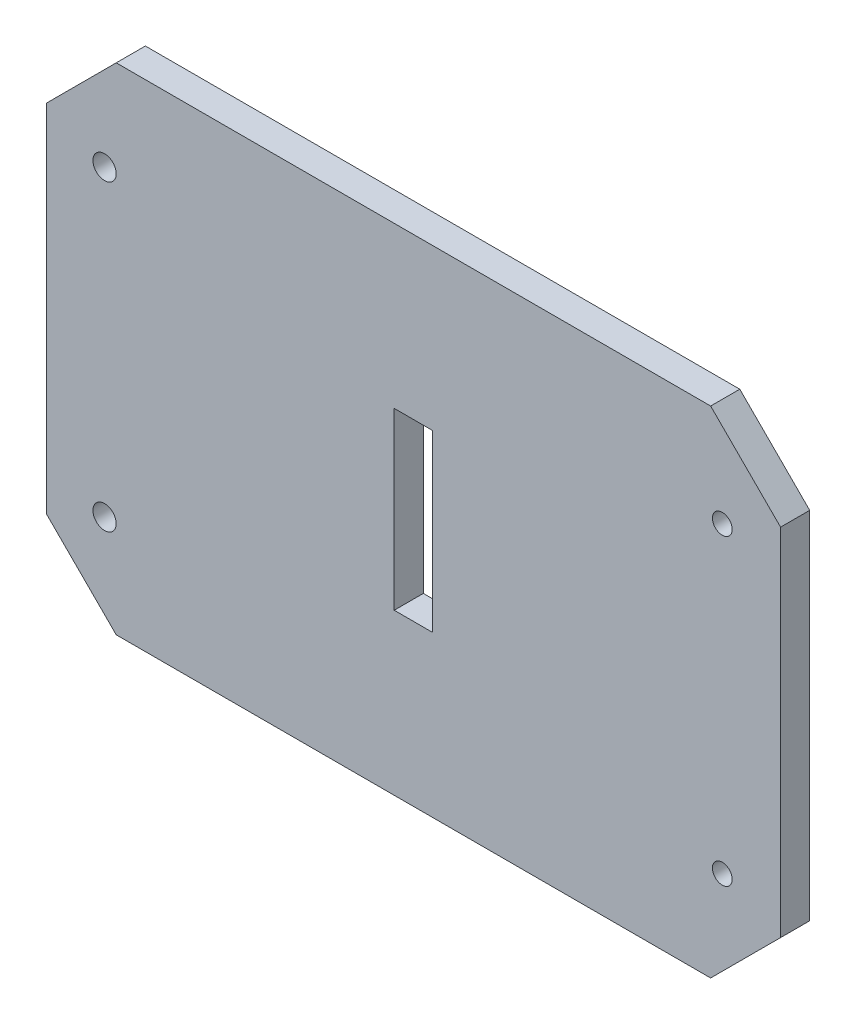
ISO-10303-21;
HEADER;
FILE_DESCRIPTION(('STEP AP214'),'2;1');
FILE_NAME('part.step','',(''),(''),'','','');
FILE_SCHEMA(('AUTOMOTIVE_DESIGN { 1 0 10303 214 1 1 1 1 }'));
ENDSEC;
DATA;
#1=APPLICATION_CONTEXT('core data for automotive mechanical design processes');
#2=APPLICATION_PROTOCOL_DEFINITION('international standard','automotive_design',2000,#1);
#3=PRODUCT_CONTEXT('',#1,'mechanical');
#4=PRODUCT('Part','Part','',(#3));
#5=PRODUCT_RELATED_PRODUCT_CATEGORY('part','',(#4));
#6=PRODUCT_DEFINITION_FORMATION('','',#4);
#7=PRODUCT_DEFINITION_CONTEXT('part definition',#1,'design');
#8=PRODUCT_DEFINITION('design','',#6,#7);
#9=PRODUCT_DEFINITION_SHAPE('','',#8);
#10=(LENGTH_UNIT() NAMED_UNIT(*) SI_UNIT(.MILLI.,.METRE.));
#11=(NAMED_UNIT(*) PLANE_ANGLE_UNIT() SI_UNIT($,.RADIAN.));
#12=(NAMED_UNIT(*) SI_UNIT($,.STERADIAN.) SOLID_ANGLE_UNIT());
#13=UNCERTAINTY_MEASURE_WITH_UNIT(LENGTH_MEASURE(1.E-05),#10,'distance_accuracy_value','');
#14=(GEOMETRIC_REPRESENTATION_CONTEXT(3) GLOBAL_UNCERTAINTY_ASSIGNED_CONTEXT((#13)) GLOBAL_UNIT_ASSIGNED_CONTEXT((#10,
#11,#12)) REPRESENTATION_CONTEXT('',''));
#15=CARTESIAN_POINT('',(0.,0.,0.));
#16=DIRECTION('',(0.,0.,1.));
#17=DIRECTION('',(1.,0.,0.));
#18=AXIS2_PLACEMENT_3D('',#15,#16,#17);
#19=CARTESIAN_POINT('',(0.,0.,5.));
#20=DIRECTION('',(0.,0.,1.));
#21=DIRECTION('',(1.,0.,0.));
#22=AXIS2_PLACEMENT_3D('',#19,#20,#21);
#23=PLANE('',#22);
#24=CARTESIAN_POINT('',(53.,-26.,5.));
#25=DIRECTION('',(0.,0.,1.));
#26=DIRECTION('',(1.,0.,0.));
#27=AXIS2_PLACEMENT_3D('',#24,#25,#26);
#28=CIRCLE('',#27,1.7);
#29=CARTESIAN_POINT('',(54.7,-26.,5.));
#30=VERTEX_POINT('',#29);
#31=EDGE_CURVE('E327',#30,#30,#28,.T.);
#32=ORIENTED_EDGE('',*,*,#31,.F.);
#33=EDGE_LOOP('',(#32));
#34=FACE_BOUND('',#33,.T.);
#35=CARTESIAN_POINT('',(-53.,-26.,5.));
#36=DIRECTION('',(0.,0.,1.));
#37=DIRECTION('',(1.,0.,0.));
#38=AXIS2_PLACEMENT_3D('',#35,#36,#37);
#39=CIRCLE('',#38,2.);
#40=CARTESIAN_POINT('',(-51.,-26.,5.));
#41=VERTEX_POINT('',#40);
#42=EDGE_CURVE('E159',#41,#41,#39,.T.);
#43=ORIENTED_EDGE('',*,*,#42,.F.);
#44=EDGE_LOOP('',(#43));
#45=FACE_BOUND('',#44,.T.);
#46=DIRECTION('',(0.707106781186544,-0.707106781186551,0.));
#47=VECTOR('',#46,1.);
#48=CARTESIAN_POINT('',(-62.9999999999999,-30.5,5.));
#49=LINE('',#48,#47);
#50=CARTESIAN_POINT('',(-62.9999999999999,-30.5,5.));
#51=VERTEX_POINT('',#50);
#52=CARTESIAN_POINT('',(-51.,-42.5,5.));
#53=VERTEX_POINT('',#52);
#54=EDGE_CURVE('E169',#51,#53,#49,.T.);
#55=ORIENTED_EDGE('',*,*,#54,.T.);
#56=DIRECTION('',(1.,0.,0.));
#57=VECTOR('',#56,1.);
#58=CARTESIAN_POINT('',(-51.,-42.5,5.));
#59=LINE('',#58,#57);
#60=CARTESIAN_POINT('',(51.,-42.5,5.));
#61=VERTEX_POINT('',#60);
#62=EDGE_CURVE('E172',#53,#61,#59,.T.);
#63=ORIENTED_EDGE('',*,*,#62,.T.);
#64=DIRECTION('',(0.707106781186546,0.707106781186549,0.));
#65=VECTOR('',#64,1.);
#66=CARTESIAN_POINT('',(51.,-42.5,5.));
#67=LINE('',#66,#65);
#68=CARTESIAN_POINT('',(63.,-30.5,5.));
#69=VERTEX_POINT('',#68);
#70=EDGE_CURVE('E175',#61,#69,#67,.T.);
#71=ORIENTED_EDGE('',*,*,#70,.T.);
#72=DIRECTION('',(0.,1.,0.));
#73=VECTOR('',#72,1.);
#74=CARTESIAN_POINT('',(63.,-30.5,5.));
#75=LINE('',#74,#73);
#76=CARTESIAN_POINT('',(63.,30.5,5.));
#77=VERTEX_POINT('',#76);
#78=EDGE_CURVE('E177',#69,#77,#75,.T.);
#79=ORIENTED_EDGE('',*,*,#78,.T.);
#80=DIRECTION('',(-0.707106781186549,0.707106781186546,0.));
#81=VECTOR('',#80,1.);
#82=CARTESIAN_POINT('',(63.,30.5,5.));
#83=LINE('',#82,#81);
#84=CARTESIAN_POINT('',(51.,42.5,5.));
#85=VERTEX_POINT('',#84);
#86=EDGE_CURVE('E179',#77,#85,#83,.T.);
#87=ORIENTED_EDGE('',*,*,#86,.T.);
#88=DIRECTION('',(-1.,0.,0.));
#89=VECTOR('',#88,1.);
#90=CARTESIAN_POINT('',(51.,42.5,5.));
#91=LINE('',#90,#89);
#92=CARTESIAN_POINT('',(-51.,42.5,5.));
#93=VERTEX_POINT('',#92);
#94=EDGE_CURVE('E181',#85,#93,#91,.T.);
#95=ORIENTED_EDGE('',*,*,#94,.T.);
#96=DIRECTION('',(-0.707106781186547,-0.707106781186548,0.));
#97=VECTOR('',#96,1.);
#98=CARTESIAN_POINT('',(-51.,42.5,5.));
#99=LINE('',#98,#97);
#100=CARTESIAN_POINT('',(-62.9999999999999,30.5,5.));
#101=VERTEX_POINT('',#100);
#102=EDGE_CURVE('E183',#93,#101,#99,.T.);
#103=ORIENTED_EDGE('',*,*,#102,.T.);
#104=DIRECTION('',(0.,-1.,0.));
#105=VECTOR('',#104,1.);
#106=CARTESIAN_POINT('',(-62.9999999999999,30.5,5.));
#107=LINE('',#106,#105);
#108=EDGE_CURVE('E185',#101,#51,#107,.T.);
#109=ORIENTED_EDGE('',*,*,#108,.T.);
#110=EDGE_LOOP('',(#55,#63,#71,#79,#87,#95,#103,#109));
#111=FACE_BOUND('',#110,.T.);
#112=DIRECTION('',(1.,0.,0.));
#113=VECTOR('',#112,1.);
#114=CARTESIAN_POINT('',(-3.3,-15.,5.));
#115=LINE('',#114,#113);
#116=CARTESIAN_POINT('',(-3.3,-15.,5.));
#117=VERTEX_POINT('',#116);
#118=CARTESIAN_POINT('',(3.3,-15.,5.));
#119=VERTEX_POINT('',#118);
#120=EDGE_CURVE('E138',#117,#119,#115,.T.);
#121=ORIENTED_EDGE('',*,*,#120,.F.);
#122=DIRECTION('',(0.,-1.,0.));
#123=VECTOR('',#122,1.);
#124=CARTESIAN_POINT('',(-3.3,-15.,5.));
#125=LINE('',#124,#123);
#126=CARTESIAN_POINT('',(-3.3,15.,5.));
#127=VERTEX_POINT('',#126);
#128=EDGE_CURVE('E130',#127,#117,#125,.T.);
#129=ORIENTED_EDGE('',*,*,#128,.F.);
#130=DIRECTION('',(-1.,0.,0.));
#131=VECTOR('',#130,1.);
#132=CARTESIAN_POINT('',(-3.3,15.,5.));
#133=LINE('',#132,#131);
#134=CARTESIAN_POINT('',(3.3,15.,5.));
#135=VERTEX_POINT('',#134);
#136=EDGE_CURVE('E153',#135,#127,#133,.T.);
#137=ORIENTED_EDGE('',*,*,#136,.F.);
#138=DIRECTION('',(0.,1.,0.));
#139=VECTOR('',#138,1.);
#140=CARTESIAN_POINT('',(3.3,-15.,5.));
#141=LINE('',#140,#139);
#142=EDGE_CURVE('E151',#119,#135,#141,.T.);
#143=ORIENTED_EDGE('',*,*,#142,.F.);
#144=EDGE_LOOP('',(#121,#129,#137,#143));
#145=FACE_BOUND('',#144,.T.);
#146=CARTESIAN_POINT('',(-53.,26.,5.));
#147=DIRECTION('',(0.,0.,1.));
#148=DIRECTION('',(1.,0.,0.));
#149=AXIS2_PLACEMENT_3D('',#146,#147,#148);
#150=CIRCLE('',#149,2.);
#151=CARTESIAN_POINT('',(-51.,26.,5.));
#152=VERTEX_POINT('',#151);
#153=EDGE_CURVE('E333',#152,#152,#150,.T.);
#154=ORIENTED_EDGE('',*,*,#153,.F.);
#155=EDGE_LOOP('',(#154));
#156=FACE_BOUND('',#155,.T.);
#157=CARTESIAN_POINT('',(53.,26.,5.));
#158=DIRECTION('',(0.,0.,1.));
#159=DIRECTION('',(1.,0.,0.));
#160=AXIS2_PLACEMENT_3D('',#157,#158,#159);
#161=CIRCLE('',#160,1.7);
#162=CARTESIAN_POINT('',(54.7,26.,5.));
#163=VERTEX_POINT('',#162);
#164=EDGE_CURVE('E318',#163,#163,#161,.T.);
#165=ORIENTED_EDGE('',*,*,#164,.F.);
#166=EDGE_LOOP('',(#165));
#167=FACE_BOUND('',#166,.T.);
#168=ADVANCED_FACE('F41',(#34,#45,#111,#145,#156,#167),#23,.T.);
#169=CARTESIAN_POINT('',(0.,0.,0.));
#170=DIRECTION('',(0.,0.,1.));
#171=DIRECTION('',(1.,0.,0.));
#172=AXIS2_PLACEMENT_3D('',#169,#170,#171);
#173=PLANE('',#172);
#174=DIRECTION('',(0.707106781186544,-0.707106781186551,0.));
#175=VECTOR('',#174,1.);
#176=CARTESIAN_POINT('',(-62.9999999999999,-30.5,0.));
#177=LINE('',#176,#175);
#178=CARTESIAN_POINT('',(-62.9999999999999,-30.5,0.));
#179=VERTEX_POINT('',#178);
#180=CARTESIAN_POINT('',(-51.,-42.5,0.));
#181=VERTEX_POINT('',#180);
#182=EDGE_CURVE('E146',#179,#181,#177,.T.);
#183=ORIENTED_EDGE('',*,*,#182,.F.);
#184=DIRECTION('',(0.,-1.,0.));
#185=VECTOR('',#184,1.);
#186=CARTESIAN_POINT('',(-62.9999999999999,30.5,0.));
#187=LINE('',#186,#185);
#188=CARTESIAN_POINT('',(-62.9999999999999,30.5,0.));
#189=VERTEX_POINT('',#188);
#190=EDGE_CURVE('E173',#189,#179,#187,.T.);
#191=ORIENTED_EDGE('',*,*,#190,.F.);
#192=DIRECTION('',(-0.707106781186547,-0.707106781186548,0.));
#193=VECTOR('',#192,1.);
#194=CARTESIAN_POINT('',(-51.,42.5,0.));
#195=LINE('',#194,#193);
#196=CARTESIAN_POINT('',(-51.,42.5,0.));
#197=VERTEX_POINT('',#196);
#198=EDGE_CURVE('E200',#197,#189,#195,.T.);
#199=ORIENTED_EDGE('',*,*,#198,.F.);
#200=DIRECTION('',(-1.,0.,0.));
#201=VECTOR('',#200,1.);
#202=CARTESIAN_POINT('',(51.,42.5,0.));
#203=LINE('',#202,#201);
#204=CARTESIAN_POINT('',(51.,42.5,0.));
#205=VERTEX_POINT('',#204);
#206=EDGE_CURVE('E198',#205,#197,#203,.T.);
#207=ORIENTED_EDGE('',*,*,#206,.F.);
#208=DIRECTION('',(-0.707106781186549,0.707106781186546,0.));
#209=VECTOR('',#208,1.);
#210=CARTESIAN_POINT('',(63.,30.5,0.));
#211=LINE('',#210,#209);
#212=CARTESIAN_POINT('',(63.,30.5,0.));
#213=VERTEX_POINT('',#212);
#214=EDGE_CURVE('E196',#213,#205,#211,.T.);
#215=ORIENTED_EDGE('',*,*,#214,.F.);
#216=DIRECTION('',(0.,1.,0.));
#217=VECTOR('',#216,1.);
#218=CARTESIAN_POINT('',(63.,-30.5,0.));
#219=LINE('',#218,#217);
#220=CARTESIAN_POINT('',(63.,-30.5,0.));
#221=VERTEX_POINT('',#220);
#222=EDGE_CURVE('E194',#221,#213,#219,.T.);
#223=ORIENTED_EDGE('',*,*,#222,.F.);
#224=DIRECTION('',(0.707106781186546,0.707106781186549,0.));
#225=VECTOR('',#224,1.);
#226=CARTESIAN_POINT('',(51.,-42.5,0.));
#227=LINE('',#226,#225);
#228=CARTESIAN_POINT('',(51.,-42.5,0.));
#229=VERTEX_POINT('',#228);
#230=EDGE_CURVE('E192',#229,#221,#227,.T.);
#231=ORIENTED_EDGE('',*,*,#230,.F.);
#232=DIRECTION('',(1.,0.,0.));
#233=VECTOR('',#232,1.);
#234=CARTESIAN_POINT('',(-51.,-42.5,0.));
#235=LINE('',#234,#233);
#236=EDGE_CURVE('E190',#181,#229,#235,.T.);
#237=ORIENTED_EDGE('',*,*,#236,.F.);
#238=EDGE_LOOP('',(#183,#191,#199,#207,#215,#223,#231,#237));
#239=FACE_BOUND('',#238,.T.);
#240=DIRECTION('',(0.,-1.,0.));
#241=VECTOR('',#240,1.);
#242=CARTESIAN_POINT('',(-3.3,-15.,0.));
#243=LINE('',#242,#241);
#244=CARTESIAN_POINT('',(-3.3,15.,0.));
#245=VERTEX_POINT('',#244);
#246=CARTESIAN_POINT('',(-3.3,-15.,0.));
#247=VERTEX_POINT('',#246);
#248=EDGE_CURVE('E64',#245,#247,#243,.T.);
#249=ORIENTED_EDGE('',*,*,#248,.T.);
#250=DIRECTION('',(1.,0.,0.));
#251=VECTOR('',#250,1.);
#252=CARTESIAN_POINT('',(-3.3,-15.,0.));
#253=LINE('',#252,#251);
#254=CARTESIAN_POINT('',(3.3,-15.,0.));
#255=VERTEX_POINT('',#254);
#256=EDGE_CURVE('E145',#247,#255,#253,.T.);
#257=ORIENTED_EDGE('',*,*,#256,.T.);
#258=DIRECTION('',(0.,1.,0.));
#259=VECTOR('',#258,1.);
#260=CARTESIAN_POINT('',(3.3,-15.,0.));
#261=LINE('',#260,#259);
#262=CARTESIAN_POINT('',(3.3,15.,0.));
#263=VERTEX_POINT('',#262);
#264=EDGE_CURVE('E161',#255,#263,#261,.T.);
#265=ORIENTED_EDGE('',*,*,#264,.T.);
#266=DIRECTION('',(-1.,0.,0.));
#267=VECTOR('',#266,1.);
#268=CARTESIAN_POINT('',(-3.3,15.,0.));
#269=LINE('',#268,#267);
#270=EDGE_CURVE('E139',#263,#245,#269,.T.);
#271=ORIENTED_EDGE('',*,*,#270,.T.);
#272=EDGE_LOOP('',(#249,#257,#265,#271));
#273=FACE_BOUND('',#272,.T.);
#274=CARTESIAN_POINT('',(-53.,-26.,0.));
#275=DIRECTION('',(0.,0.,1.));
#276=DIRECTION('',(1.,0.,0.));
#277=AXIS2_PLACEMENT_3D('',#274,#275,#276);
#278=CIRCLE('',#277,2.);
#279=CARTESIAN_POINT('',(-51.,-26.,0.));
#280=VERTEX_POINT('',#279);
#281=EDGE_CURVE('E336',#280,#280,#278,.T.);
#282=ORIENTED_EDGE('',*,*,#281,.T.);
#283=EDGE_LOOP('',(#282));
#284=FACE_BOUND('',#283,.T.);
#285=CARTESIAN_POINT('',(-53.,26.,0.));
#286=DIRECTION('',(0.,0.,1.));
#287=DIRECTION('',(1.,0.,0.));
#288=AXIS2_PLACEMENT_3D('',#285,#286,#287);
#289=CIRCLE('',#288,2.);
#290=CARTESIAN_POINT('',(-51.,26.,0.));
#291=VERTEX_POINT('',#290);
#292=EDGE_CURVE('E330',#291,#291,#289,.T.);
#293=ORIENTED_EDGE('',*,*,#292,.T.);
#294=EDGE_LOOP('',(#293));
#295=FACE_BOUND('',#294,.T.);
#296=CARTESIAN_POINT('',(53.,-26.,0.));
#297=DIRECTION('',(0.,0.,1.));
#298=DIRECTION('',(1.,0.,0.));
#299=AXIS2_PLACEMENT_3D('',#296,#297,#298);
#300=CIRCLE('',#299,1.7);
#301=CARTESIAN_POINT('',(54.7,-26.,0.));
#302=VERTEX_POINT('',#301);
#303=EDGE_CURVE('E324',#302,#302,#300,.T.);
#304=ORIENTED_EDGE('',*,*,#303,.T.);
#305=EDGE_LOOP('',(#304));
#306=FACE_BOUND('',#305,.T.);
#307=CARTESIAN_POINT('',(53.,26.,0.));
#308=DIRECTION('',(0.,0.,1.));
#309=DIRECTION('',(1.,0.,0.));
#310=AXIS2_PLACEMENT_3D('',#307,#308,#309);
#311=CIRCLE('',#310,1.7);
#312=CARTESIAN_POINT('',(54.7,26.,0.));
#313=VERTEX_POINT('',#312);
#314=EDGE_CURVE('E321',#313,#313,#311,.T.);
#315=ORIENTED_EDGE('',*,*,#314,.T.);
#316=EDGE_LOOP('',(#315));
#317=FACE_BOUND('',#316,.T.);
#318=ADVANCED_FACE('F230',(#239,#273,#284,#295,#306,#317),#173,.F.);
#319=CARTESIAN_POINT('',(-62.9999999999999,-30.5,5.));
#320=DIRECTION('',(0.707106781186551,0.707106781186544,0.));
#321=DIRECTION('',(-0.707106781186544,0.707106781186551,0.));
#322=AXIS2_PLACEMENT_3D('',#319,#320,#321);
#323=PLANE('',#322);
#324=ORIENTED_EDGE('',*,*,#182,.T.);
#325=DIRECTION('',(0.,0.,-1.));
#326=VECTOR('',#325,1.);
#327=CARTESIAN_POINT('',(-51.,-42.5,5.));
#328=LINE('',#327,#326);
#329=EDGE_CURVE('E11',#53,#181,#328,.T.);
#330=ORIENTED_EDGE('',*,*,#329,.F.);
#331=ORIENTED_EDGE('',*,*,#54,.F.);
#332=DIRECTION('',(0.,0.,-1.));
#333=VECTOR('',#332,1.);
#334=CARTESIAN_POINT('',(-62.9999999999999,-30.5,5.));
#335=LINE('',#334,#333);
#336=EDGE_CURVE('E187',#51,#179,#335,.T.);
#337=ORIENTED_EDGE('',*,*,#336,.T.);
#338=EDGE_LOOP('',(#324,#330,#331,#337));
#339=FACE_BOUND('',#338,.T.);
#340=ADVANCED_FACE('F43',(#339),#323,.F.);
#341=CARTESIAN_POINT('',(-51.,-42.5,5.));
#342=DIRECTION('',(0.,1.,0.));
#343=DIRECTION('',(0.,0.,1.));
#344=AXIS2_PLACEMENT_3D('',#341,#342,#343);
#345=PLANE('',#344);
#346=ORIENTED_EDGE('',*,*,#236,.T.);
#347=DIRECTION('',(0.,0.,-1.));
#348=VECTOR('',#347,1.);
#349=CARTESIAN_POINT('',(51.,-42.5,5.));
#350=LINE('',#349,#348);
#351=EDGE_CURVE('E49',#61,#229,#350,.T.);
#352=ORIENTED_EDGE('',*,*,#351,.F.);
#353=ORIENTED_EDGE('',*,*,#62,.F.);
#354=ORIENTED_EDGE('',*,*,#329,.T.);
#355=EDGE_LOOP('',(#346,#352,#353,#354));
#356=FACE_BOUND('',#355,.T.);
#357=ADVANCED_FACE('F247',(#356),#345,.F.);
#358=CARTESIAN_POINT('',(51.,-42.5,5.));
#359=DIRECTION('',(-0.707106781186549,0.707106781186546,0.));
#360=DIRECTION('',(-0.707106781186546,-0.707106781186549,0.));
#361=AXIS2_PLACEMENT_3D('',#358,#359,#360);
#362=PLANE('',#361);
#363=ORIENTED_EDGE('',*,*,#230,.T.);
#364=DIRECTION('',(0.,0.,-1.));
#365=VECTOR('',#364,1.);
#366=CARTESIAN_POINT('',(63.,-30.5,5.));
#367=LINE('',#366,#365);
#368=EDGE_CURVE('E217',#69,#221,#367,.T.);
#369=ORIENTED_EDGE('',*,*,#368,.F.);
#370=ORIENTED_EDGE('',*,*,#70,.F.);
#371=ORIENTED_EDGE('',*,*,#351,.T.);
#372=EDGE_LOOP('',(#363,#369,#370,#371));
#373=FACE_BOUND('',#372,.T.);
#374=ADVANCED_FACE('F224',(#373),#362,.F.);
#375=CARTESIAN_POINT('',(63.,-30.5,5.));
#376=DIRECTION('',(-1.,0.,0.));
#377=DIRECTION('',(0.,0.,1.));
#378=AXIS2_PLACEMENT_3D('',#375,#376,#377);
#379=PLANE('',#378);
#380=ORIENTED_EDGE('',*,*,#222,.T.);
#381=DIRECTION('',(0.,0.,-1.));
#382=VECTOR('',#381,1.);
#383=CARTESIAN_POINT('',(63.,30.5,5.));
#384=LINE('',#383,#382);
#385=EDGE_CURVE('E214',#77,#213,#384,.T.);
#386=ORIENTED_EDGE('',*,*,#385,.F.);
#387=ORIENTED_EDGE('',*,*,#78,.F.);
#388=ORIENTED_EDGE('',*,*,#368,.T.);
#389=EDGE_LOOP('',(#380,#386,#387,#388));
#390=FACE_BOUND('',#389,.T.);
#391=ADVANCED_FACE('F236',(#390),#379,.F.);
#392=CARTESIAN_POINT('',(63.,30.5,5.));
#393=DIRECTION('',(-0.707106781186546,-0.707106781186549,0.));
#394=DIRECTION('',(0.707106781186549,-0.707106781186546,0.));
#395=AXIS2_PLACEMENT_3D('',#392,#393,#394);
#396=PLANE('',#395);
#397=ORIENTED_EDGE('',*,*,#214,.T.);
#398=DIRECTION('',(0.,0.,-1.));
#399=VECTOR('',#398,1.);
#400=CARTESIAN_POINT('',(51.,42.5,5.));
#401=LINE('',#400,#399);
#402=EDGE_CURVE('E211',#85,#205,#401,.T.);
#403=ORIENTED_EDGE('',*,*,#402,.F.);
#404=ORIENTED_EDGE('',*,*,#86,.F.);
#405=ORIENTED_EDGE('',*,*,#385,.T.);
#406=EDGE_LOOP('',(#397,#403,#404,#405));
#407=FACE_BOUND('',#406,.T.);
#408=ADVANCED_FACE('F240',(#407),#396,.F.);
#409=CARTESIAN_POINT('',(51.,42.5,5.));
#410=DIRECTION('',(0.,-1.,0.));
#411=DIRECTION('',(0.,0.,-1.));
#412=AXIS2_PLACEMENT_3D('',#409,#410,#411);
#413=PLANE('',#412);
#414=ORIENTED_EDGE('',*,*,#206,.T.);
#415=DIRECTION('',(0.,0.,-1.));
#416=VECTOR('',#415,1.);
#417=CARTESIAN_POINT('',(-51.,42.5,5.));
#418=LINE('',#417,#416);
#419=EDGE_CURVE('E208',#93,#197,#418,.T.);
#420=ORIENTED_EDGE('',*,*,#419,.F.);
#421=ORIENTED_EDGE('',*,*,#94,.F.);
#422=ORIENTED_EDGE('',*,*,#402,.T.);
#423=EDGE_LOOP('',(#414,#420,#421,#422));
#424=FACE_BOUND('',#423,.T.);
#425=ADVANCED_FACE('F260',(#424),#413,.F.);
#426=CARTESIAN_POINT('',(-51.,42.5,5.));
#427=DIRECTION('',(0.707106781186548,-0.707106781186547,0.));
#428=DIRECTION('',(0.707106781186547,0.707106781186548,0.));
#429=AXIS2_PLACEMENT_3D('',#426,#427,#428);
#430=PLANE('',#429);
#431=ORIENTED_EDGE('',*,*,#198,.T.);
#432=DIRECTION('',(0.,0.,-1.));
#433=VECTOR('',#432,1.);
#434=CARTESIAN_POINT('',(-62.9999999999999,30.5,5.));
#435=LINE('',#434,#433);
#436=EDGE_CURVE('E205',#101,#189,#435,.T.);
#437=ORIENTED_EDGE('',*,*,#436,.F.);
#438=ORIENTED_EDGE('',*,*,#102,.F.);
#439=ORIENTED_EDGE('',*,*,#419,.T.);
#440=EDGE_LOOP('',(#431,#437,#438,#439));
#441=FACE_BOUND('',#440,.T.);
#442=ADVANCED_FACE('F258',(#441),#430,.F.);
#443=CARTESIAN_POINT('',(-62.9999999999999,30.5,5.));
#444=DIRECTION('',(1.,0.,0.));
#445=DIRECTION('',(0.,0.,-1.));
#446=AXIS2_PLACEMENT_3D('',#443,#444,#445);
#447=PLANE('',#446);
#448=ORIENTED_EDGE('',*,*,#190,.T.);
#449=ORIENTED_EDGE('',*,*,#336,.F.);
#450=ORIENTED_EDGE('',*,*,#108,.F.);
#451=ORIENTED_EDGE('',*,*,#436,.T.);
#452=EDGE_LOOP('',(#448,#449,#450,#451));
#453=FACE_BOUND('',#452,.T.);
#454=ADVANCED_FACE('F253',(#453),#447,.F.);
#455=CARTESIAN_POINT('',(-3.3,-15.,5.));
#456=DIRECTION('',(1.,0.,0.));
#457=DIRECTION('',(0.,0.,-1.));
#458=AXIS2_PLACEMENT_3D('',#455,#456,#457);
#459=PLANE('',#458);
#460=ORIENTED_EDGE('',*,*,#248,.F.);
#461=DIRECTION('',(0.,0.,-1.));
#462=VECTOR('',#461,1.);
#463=CARTESIAN_POINT('',(-3.3,15.,5.));
#464=LINE('',#463,#462);
#465=EDGE_CURVE('E134',#127,#245,#464,.T.);
#466=ORIENTED_EDGE('',*,*,#465,.F.);
#467=ORIENTED_EDGE('',*,*,#128,.T.);
#468=DIRECTION('',(0.,0.,-1.));
#469=VECTOR('',#468,1.);
#470=CARTESIAN_POINT('',(-3.3,-15.,5.));
#471=LINE('',#470,#469);
#472=EDGE_CURVE('E133',#117,#247,#471,.T.);
#473=ORIENTED_EDGE('',*,*,#472,.T.);
#474=EDGE_LOOP('',(#460,#466,#467,#473));
#475=FACE_BOUND('',#474,.T.);
#476=ADVANCED_FACE('F132',(#475),#459,.T.);
#477=CARTESIAN_POINT('',(-3.3,-15.,5.));
#478=DIRECTION('',(0.,1.,0.));
#479=DIRECTION('',(0.,0.,1.));
#480=AXIS2_PLACEMENT_3D('',#477,#478,#479);
#481=PLANE('',#480);
#482=ORIENTED_EDGE('',*,*,#256,.F.);
#483=ORIENTED_EDGE('',*,*,#472,.F.);
#484=ORIENTED_EDGE('',*,*,#120,.T.);
#485=DIRECTION('',(0.,0.,-1.));
#486=VECTOR('',#485,1.);
#487=CARTESIAN_POINT('',(3.3,-15.,5.));
#488=LINE('',#487,#486);
#489=EDGE_CURVE('E147',#119,#255,#488,.T.);
#490=ORIENTED_EDGE('',*,*,#489,.T.);
#491=EDGE_LOOP('',(#482,#483,#484,#490));
#492=FACE_BOUND('',#491,.T.);
#493=ADVANCED_FACE('F142',(#492),#481,.T.);
#494=CARTESIAN_POINT('',(3.3,-15.,5.));
#495=DIRECTION('',(-1.,0.,0.));
#496=DIRECTION('',(0.,0.,1.));
#497=AXIS2_PLACEMENT_3D('',#494,#495,#496);
#498=PLANE('',#497);
#499=ORIENTED_EDGE('',*,*,#264,.F.);
#500=ORIENTED_EDGE('',*,*,#489,.F.);
#501=ORIENTED_EDGE('',*,*,#142,.T.);
#502=DIRECTION('',(0.,0.,-1.));
#503=VECTOR('',#502,1.);
#504=CARTESIAN_POINT('',(3.3,15.,5.));
#505=LINE('',#504,#503);
#506=EDGE_CURVE('E56',#135,#263,#505,.T.);
#507=ORIENTED_EDGE('',*,*,#506,.T.);
#508=EDGE_LOOP('',(#499,#500,#501,#507));
#509=FACE_BOUND('',#508,.T.);
#510=ADVANCED_FACE('F288',(#509),#498,.T.);
#511=CARTESIAN_POINT('',(-3.3,15.,5.));
#512=DIRECTION('',(0.,-1.,0.));
#513=DIRECTION('',(0.,0.,-1.));
#514=AXIS2_PLACEMENT_3D('',#511,#512,#513);
#515=PLANE('',#514);
#516=ORIENTED_EDGE('',*,*,#270,.F.);
#517=ORIENTED_EDGE('',*,*,#506,.F.);
#518=ORIENTED_EDGE('',*,*,#136,.T.);
#519=ORIENTED_EDGE('',*,*,#465,.T.);
#520=EDGE_LOOP('',(#516,#517,#518,#519));
#521=FACE_BOUND('',#520,.T.);
#522=ADVANCED_FACE('F292',(#521),#515,.T.);
#523=CARTESIAN_POINT('',(-53.,-26.,5.));
#524=DIRECTION('',(0.,0.,-1.));
#525=DIRECTION('',(-1.,0.,0.));
#526=AXIS2_PLACEMENT_3D('',#523,#524,#525);
#527=CYLINDRICAL_SURFACE('',#526,2.);
#528=ORIENTED_EDGE('',*,*,#42,.T.);
#529=EDGE_LOOP('',(#528));
#530=FACE_BOUND('',#529,.T.);
#531=ORIENTED_EDGE('',*,*,#281,.F.);
#532=EDGE_LOOP('',(#531));
#533=FACE_BOUND('',#532,.T.);
#534=ADVANCED_FACE('F298',(#530,#533),#527,.F.);
#535=CARTESIAN_POINT('',(-53.,26.,5.));
#536=DIRECTION('',(0.,0.,-1.));
#537=DIRECTION('',(-1.,0.,0.));
#538=AXIS2_PLACEMENT_3D('',#535,#536,#537);
#539=CYLINDRICAL_SURFACE('',#538,2.);
#540=ORIENTED_EDGE('',*,*,#153,.T.);
#541=EDGE_LOOP('',(#540));
#542=FACE_BOUND('',#541,.T.);
#543=ORIENTED_EDGE('',*,*,#292,.F.);
#544=EDGE_LOOP('',(#543));
#545=FACE_BOUND('',#544,.T.);
#546=ADVANCED_FACE('F301',(#542,#545),#539,.F.);
#547=CARTESIAN_POINT('',(53.,-26.,5.));
#548=DIRECTION('',(0.,0.,-1.));
#549=DIRECTION('',(-1.,0.,0.));
#550=AXIS2_PLACEMENT_3D('',#547,#548,#549);
#551=CYLINDRICAL_SURFACE('',#550,1.7);
#552=ORIENTED_EDGE('',*,*,#31,.T.);
#553=EDGE_LOOP('',(#552));
#554=FACE_BOUND('',#553,.T.);
#555=ORIENTED_EDGE('',*,*,#303,.F.);
#556=EDGE_LOOP('',(#555));
#557=FACE_BOUND('',#556,.T.);
#558=ADVANCED_FACE('F305',(#554,#557),#551,.F.);
#559=CARTESIAN_POINT('',(53.,26.,5.));
#560=DIRECTION('',(0.,0.,-1.));
#561=DIRECTION('',(-1.,0.,0.));
#562=AXIS2_PLACEMENT_3D('',#559,#560,#561);
#563=CYLINDRICAL_SURFACE('',#562,1.7);
#564=ORIENTED_EDGE('',*,*,#164,.T.);
#565=EDGE_LOOP('',(#564));
#566=FACE_BOUND('',#565,.T.);
#567=ORIENTED_EDGE('',*,*,#314,.F.);
#568=EDGE_LOOP('',(#567));
#569=FACE_BOUND('',#568,.T.);
#570=ADVANCED_FACE('F309',(#566,#569),#563,.F.);
#571=CLOSED_SHELL('',(#168,#318,#340,#357,#374,#391,#408,#425,#442,#454,#476,#493,#510,#522,
#534,#546,#558,#570));
#572=MANIFOLD_SOLID_BREP('B2',#571);
#573=ADVANCED_BREP_SHAPE_REPRESENTATION('',(#18,#572),#14);
#574=SHAPE_DEFINITION_REPRESENTATION(#9,#573);
ENDSEC;
END-ISO-10303-21;
